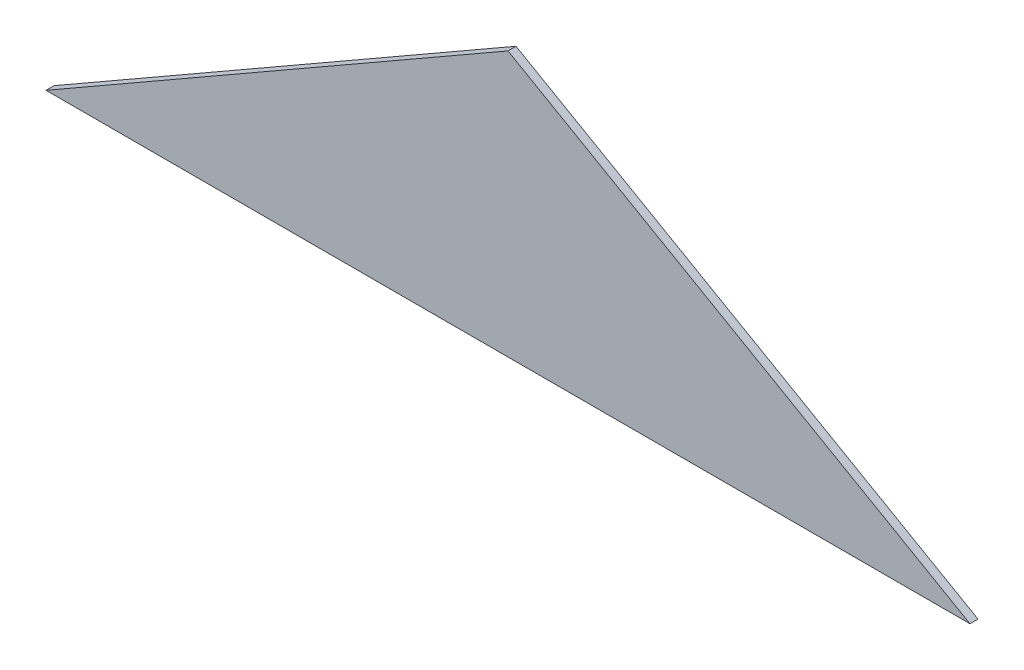
ISO-10303-21;
HEADER;
FILE_DESCRIPTION(('STEP AP214'),'2;1');
FILE_NAME('part.step','',(''),(''),'','','');
FILE_SCHEMA(('AUTOMOTIVE_DESIGN { 1 0 10303 214 1 1 1 1 }'));
ENDSEC;
DATA;
#1=APPLICATION_CONTEXT('core data for automotive mechanical design processes');
#2=APPLICATION_PROTOCOL_DEFINITION('international standard','automotive_design',2000,#1);
#3=PRODUCT_CONTEXT('',#1,'mechanical');
#4=PRODUCT('Part','Part','',(#3));
#5=PRODUCT_RELATED_PRODUCT_CATEGORY('part','',(#4));
#6=PRODUCT_DEFINITION_FORMATION('','',#4);
#7=PRODUCT_DEFINITION_CONTEXT('part definition',#1,'design');
#8=PRODUCT_DEFINITION('design','',#6,#7);
#9=PRODUCT_DEFINITION_SHAPE('','',#8);
#10=(LENGTH_UNIT() NAMED_UNIT(*) SI_UNIT(.MILLI.,.METRE.));
#11=(NAMED_UNIT(*) PLANE_ANGLE_UNIT() SI_UNIT($,.RADIAN.));
#12=(NAMED_UNIT(*) SI_UNIT($,.STERADIAN.) SOLID_ANGLE_UNIT());
#13=UNCERTAINTY_MEASURE_WITH_UNIT(LENGTH_MEASURE(1.E-05),#10,'distance_accuracy_value','');
#14=(GEOMETRIC_REPRESENTATION_CONTEXT(3) GLOBAL_UNCERTAINTY_ASSIGNED_CONTEXT((#13)) GLOBAL_UNIT_ASSIGNED_CONTEXT((#10,
#11,#12)) REPRESENTATION_CONTEXT('',''));
#15=CARTESIAN_POINT('',(0.,0.,0.));
#16=DIRECTION('',(0.,0.,1.));
#17=DIRECTION('',(1.,0.,0.));
#18=AXIS2_PLACEMENT_3D('',#15,#16,#17);
#19=CARTESIAN_POINT('',(0.576236907131959,-2.64021759407,0.));
#20=DIRECTION('',(0.497708050942986,0.867344623564667,0.));
#21=DIRECTION('',(-0.867344623564667,0.497708050942986,0.));
#22=AXIS2_PLACEMENT_3D('',#19,#20,#21);
#23=PLANE('',#22);
#24=DIRECTION('',(-0.867344623564667,0.497708050942986,0.));
#25=VECTOR('',#24,1.);
#26=CARTESIAN_POINT('',(0.576236907131959,-2.64021759407,0.));
#27=LINE('',#26,#25);
#28=CARTESIAN_POINT('',(0.576236907131959,-2.64021759407,0.));
#29=VERTEX_POINT('',#28);
#30=CARTESIAN_POINT('',(0.404287961329069,-2.541548192829,0.));
#31=VERTEX_POINT('',#30);
#32=EDGE_CURVE('E11',#29,#31,#27,.T.);
#33=ORIENTED_EDGE('',*,*,#32,.T.);
#34=DIRECTION('',(0.,0.,1.));
#35=VECTOR('',#34,1.);
#36=CARTESIAN_POINT('',(0.404287961329069,-2.541548192829,0.));
#37=LINE('',#36,#35);
#38=CARTESIAN_POINT('',(0.404287961329069,-2.541548192829,0.003));
#39=VERTEX_POINT('',#38);
#40=EDGE_CURVE('E24',#31,#39,#37,.T.);
#41=ORIENTED_EDGE('',*,*,#40,.T.);
#42=DIRECTION('',(-0.867344623564667,0.497708050942986,0.));
#43=VECTOR('',#42,1.);
#44=CARTESIAN_POINT('',(0.576236907131959,-2.64021759407,0.003));
#45=LINE('',#44,#43);
#46=CARTESIAN_POINT('',(0.576236907131959,-2.64021759407,0.003));
#47=VERTEX_POINT('',#46);
#48=EDGE_CURVE('E67',#47,#39,#45,.T.);
#49=ORIENTED_EDGE('',*,*,#48,.F.);
#50=DIRECTION('',(0.,0.,1.));
#51=VECTOR('',#50,1.);
#52=CARTESIAN_POINT('',(0.576236907131959,-2.64021759407,0.));
#53=LINE('',#52,#51);
#54=EDGE_CURVE('E54',#29,#47,#53,.T.);
#55=ORIENTED_EDGE('',*,*,#54,.F.);
#56=EDGE_LOOP('',(#33,#41,#49,#55));
#57=FACE_BOUND('',#56,.T.);
#58=ADVANCED_FACE('F17',(#57),#23,.T.);
#59=CARTESIAN_POINT('',(0.232339015526201,-2.64021759407,0.));
#60=DIRECTION('',(0.,-1.,0.));
#61=DIRECTION('',(1.,0.,0.));
#62=AXIS2_PLACEMENT_3D('',#59,#60,#61);
#63=PLANE('',#62);
#64=DIRECTION('',(1.,0.,0.));
#65=VECTOR('',#64,1.);
#66=CARTESIAN_POINT('',(0.232339015526201,-2.64021759407,0.));
#67=LINE('',#66,#65);
#68=CARTESIAN_POINT('',(0.232339015526201,-2.64021759407,0.));
#69=VERTEX_POINT('',#68);
#70=EDGE_CURVE('E58',#69,#29,#67,.T.);
#71=ORIENTED_EDGE('',*,*,#70,.T.);
#72=ORIENTED_EDGE('',*,*,#54,.T.);
#73=DIRECTION('',(1.,0.,0.));
#74=VECTOR('',#73,1.);
#75=CARTESIAN_POINT('',(0.232339015526201,-2.64021759407,0.003));
#76=LINE('',#75,#74);
#77=CARTESIAN_POINT('',(0.232339015526201,-2.64021759407,0.003));
#78=VERTEX_POINT('',#77);
#79=EDGE_CURVE('E48',#78,#47,#76,.T.);
#80=ORIENTED_EDGE('',*,*,#79,.F.);
#81=DIRECTION('',(0.,0.,1.));
#82=VECTOR('',#81,1.);
#83=CARTESIAN_POINT('',(0.232339015526201,-2.64021759407,0.));
#84=LINE('',#83,#82);
#85=EDGE_CURVE('E52',#69,#78,#84,.T.);
#86=ORIENTED_EDGE('',*,*,#85,.F.);
#87=EDGE_LOOP('',(#71,#72,#80,#86));
#88=FACE_BOUND('',#87,.T.);
#89=ADVANCED_FACE('F51',(#88),#63,.T.);
#90=CARTESIAN_POINT('',(0.404287961329069,-2.541548192829,0.));
#91=DIRECTION('',(-0.497708050943016,0.86734462356465,0.));
#92=DIRECTION('',(-0.86734462356465,-0.497708050943016,0.));
#93=AXIS2_PLACEMENT_3D('',#90,#91,#92);
#94=PLANE('',#93);
#95=DIRECTION('',(-0.86734462356465,-0.497708050943016,0.));
#96=VECTOR('',#95,1.);
#97=CARTESIAN_POINT('',(0.404287961329069,-2.541548192829,0.));
#98=LINE('',#97,#96);
#99=EDGE_CURVE('E64',#31,#69,#98,.T.);
#100=ORIENTED_EDGE('',*,*,#99,.T.);
#101=ORIENTED_EDGE('',*,*,#85,.T.);
#102=DIRECTION('',(-0.86734462356465,-0.497708050943016,0.));
#103=VECTOR('',#102,1.);
#104=CARTESIAN_POINT('',(0.404287961329069,-2.541548192829,0.003));
#105=LINE('',#104,#103);
#106=EDGE_CURVE('E63',#39,#78,#105,.T.);
#107=ORIENTED_EDGE('',*,*,#106,.F.);
#108=ORIENTED_EDGE('',*,*,#40,.F.);
#109=EDGE_LOOP('',(#100,#101,#107,#108));
#110=FACE_BOUND('',#109,.T.);
#111=ADVANCED_FACE('F62',(#110),#94,.T.);
#112=CARTESIAN_POINT('',(0.40428796132908,-2.59088289345,0.003));
#113=DIRECTION('',(0.,0.,1.));
#114=DIRECTION('',(1.,0.,0.));
#115=AXIS2_PLACEMENT_3D('',#112,#113,#114);
#116=PLANE('',#115);
#117=ORIENTED_EDGE('',*,*,#106,.T.);
#118=ORIENTED_EDGE('',*,*,#79,.T.);
#119=ORIENTED_EDGE('',*,*,#48,.T.);
#120=EDGE_LOOP('',(#117,#118,#119));
#121=FACE_BOUND('',#120,.T.);
#122=ADVANCED_FACE('F66',(#121),#116,.T.);
#123=CARTESIAN_POINT('',(0.40428796132908,-2.59088289345,0.));
#124=DIRECTION('',(0.,0.,1.));
#125=DIRECTION('',(1.,0.,0.));
#126=AXIS2_PLACEMENT_3D('',#123,#124,#125);
#127=PLANE('',#126);
#128=ORIENTED_EDGE('',*,*,#99,.F.);
#129=ORIENTED_EDGE('',*,*,#32,.F.);
#130=ORIENTED_EDGE('',*,*,#70,.F.);
#131=EDGE_LOOP('',(#128,#129,#130));
#132=FACE_BOUND('',#131,.T.);
#133=ADVANCED_FACE('F73',(#132),#127,.F.);
#134=CLOSED_SHELL('',(#58,#89,#111,#122,#133));
#135=MANIFOLD_SOLID_BREP('B1',#134);
#136=ADVANCED_BREP_SHAPE_REPRESENTATION('',(#18,#135),#14);
#137=SHAPE_DEFINITION_REPRESENTATION(#9,#136);
ENDSEC;
END-ISO-10303-21;
